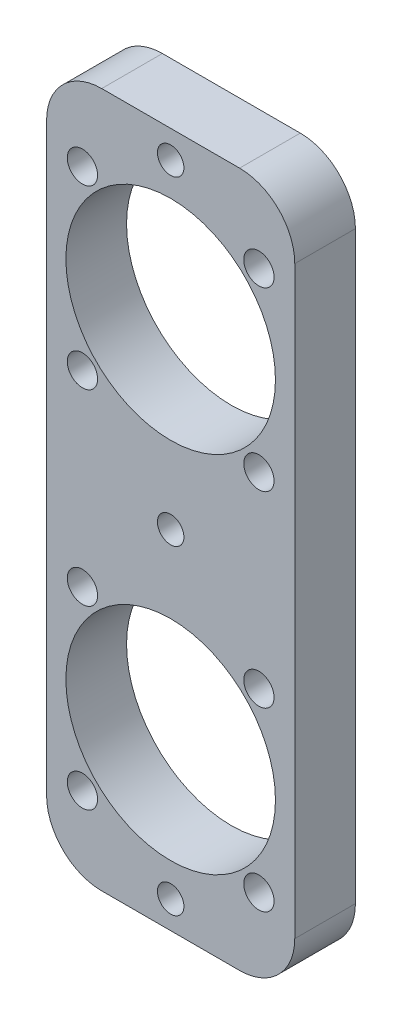
ISO-10303-21;
HEADER;
FILE_DESCRIPTION(('STEP AP214'),'2;1');
FILE_NAME('part.step','',(''),(''),'','','');
FILE_SCHEMA(('AUTOMOTIVE_DESIGN { 1 0 10303 214 1 1 1 1 }'));
ENDSEC;
DATA;
#1=APPLICATION_CONTEXT('core data for automotive mechanical design processes');
#2=APPLICATION_PROTOCOL_DEFINITION('international standard','automotive_design',2000,#1);
#3=PRODUCT_CONTEXT('',#1,'mechanical');
#4=PRODUCT('Part','Part','',(#3));
#5=PRODUCT_RELATED_PRODUCT_CATEGORY('part','',(#4));
#6=PRODUCT_DEFINITION_FORMATION('','',#4);
#7=PRODUCT_DEFINITION_CONTEXT('part definition',#1,'design');
#8=PRODUCT_DEFINITION('design','',#6,#7);
#9=PRODUCT_DEFINITION_SHAPE('','',#8);
#10=(LENGTH_UNIT() NAMED_UNIT(*) SI_UNIT(.MILLI.,.METRE.));
#11=(NAMED_UNIT(*) PLANE_ANGLE_UNIT() SI_UNIT($,.RADIAN.));
#12=(NAMED_UNIT(*) SI_UNIT($,.STERADIAN.) SOLID_ANGLE_UNIT());
#13=UNCERTAINTY_MEASURE_WITH_UNIT(LENGTH_MEASURE(1.E-05),#10,'distance_accuracy_value','');
#14=(GEOMETRIC_REPRESENTATION_CONTEXT(3) GLOBAL_UNCERTAINTY_ASSIGNED_CONTEXT((#13)) GLOBAL_UNIT_ASSIGNED_CONTEXT((#10,
#11,#12)) REPRESENTATION_CONTEXT('',''));
#15=CARTESIAN_POINT('',(0.,0.,0.));
#16=DIRECTION('',(0.,0.,1.));
#17=DIRECTION('',(1.,0.,0.));
#18=AXIS2_PLACEMENT_3D('',#15,#16,#17);
#19=CARTESIAN_POINT('',(-22.5,0.,-11.));
#20=DIRECTION('',(1.,0.,0.));
#21=DIRECTION('',(0.,0.,-1.));
#22=AXIS2_PLACEMENT_3D('',#19,#20,#21);
#23=PLANE('',#22);
#24=DIRECTION('',(0.,1.,0.));
#25=VECTOR('',#24,1.);
#26=CARTESIAN_POINT('',(-22.5,0.,-11.));
#27=LINE('',#26,#25);
#28=CARTESIAN_POINT('',(-22.5,-86.0000000000003,-11.));
#29=VERTEX_POINT('',#28);
#30=CARTESIAN_POINT('',(-22.5,20.0000000000001,-11.));
#31=VERTEX_POINT('',#30);
#32=EDGE_CURVE('E134',#29,#31,#27,.T.);
#33=ORIENTED_EDGE('',*,*,#32,.F.);
#34=DIRECTION('',(0.,0.,1.));
#35=VECTOR('',#34,1.);
#36=CARTESIAN_POINT('',(-22.5,-86.0000000000003,0.));
#37=LINE('',#36,#35);
#38=CARTESIAN_POINT('',(-22.5,-86.0000000000003,0.));
#39=VERTEX_POINT('',#38);
#40=EDGE_CURVE('E119',#29,#39,#37,.T.);
#41=ORIENTED_EDGE('',*,*,#40,.T.);
#42=DIRECTION('',(0.,1.,0.));
#43=VECTOR('',#42,1.);
#44=CARTESIAN_POINT('',(-22.5,0.,0.));
#45=LINE('',#44,#43);
#46=CARTESIAN_POINT('',(-22.5,20.0000000000001,0.));
#47=VERTEX_POINT('',#46);
#48=EDGE_CURVE('E132',#39,#47,#45,.T.);
#49=ORIENTED_EDGE('',*,*,#48,.T.);
#50=DIRECTION('',(0.,0.,1.));
#51=VECTOR('',#50,1.);
#52=CARTESIAN_POINT('',(-22.5,20.0000000000001,-11.));
#53=LINE('',#52,#51);
#54=EDGE_CURVE('E137',#47,#31,#53,.F.);
#55=ORIENTED_EDGE('',*,*,#54,.T.);
#56=EDGE_LOOP('',(#33,#41,#49,#55));
#57=FACE_BOUND('',#56,.T.);
#58=ADVANCED_FACE('F49',(#57),#23,.F.);
#59=CARTESIAN_POINT('',(0.,30.0000000000001,-11.));
#60=DIRECTION('',(0.,-1.,0.));
#61=DIRECTION('',(0.,0.,-1.));
#62=AXIS2_PLACEMENT_3D('',#59,#60,#61);
#63=PLANE('',#62);
#64=DIRECTION('',(1.,0.,0.));
#65=VECTOR('',#64,1.);
#66=CARTESIAN_POINT('',(0.,30.0000000000001,0.));
#67=LINE('',#66,#65);
#68=CARTESIAN_POINT('',(-12.5,30.0000000000001,0.));
#69=VERTEX_POINT('',#68);
#70=CARTESIAN_POINT('',(12.5,30.0000000000001,0.));
#71=VERTEX_POINT('',#70);
#72=EDGE_CURVE('E143',#69,#71,#67,.T.);
#73=ORIENTED_EDGE('',*,*,#72,.T.);
#74=DIRECTION('',(0.,0.,1.));
#75=VECTOR('',#74,1.);
#76=CARTESIAN_POINT('',(12.5,30.0000000000001,-11.));
#77=LINE('',#76,#75);
#78=CARTESIAN_POINT('',(12.5,30.0000000000001,-11.));
#79=VERTEX_POINT('',#78);
#80=EDGE_CURVE('E11',#71,#79,#77,.F.);
#81=ORIENTED_EDGE('',*,*,#80,.T.);
#82=DIRECTION('',(1.,0.,0.));
#83=VECTOR('',#82,1.);
#84=CARTESIAN_POINT('',(0.,30.0000000000001,-11.));
#85=LINE('',#84,#83);
#86=CARTESIAN_POINT('',(-12.5,30.0000000000001,-11.));
#87=VERTEX_POINT('',#86);
#88=EDGE_CURVE('E148',#87,#79,#85,.T.);
#89=ORIENTED_EDGE('',*,*,#88,.F.);
#90=DIRECTION('',(0.,0.,1.));
#91=VECTOR('',#90,1.);
#92=CARTESIAN_POINT('',(-12.5,30.0000000000001,-11.));
#93=LINE('',#92,#91);
#94=EDGE_CURVE('E58',#87,#69,#93,.T.);
#95=ORIENTED_EDGE('',*,*,#94,.T.);
#96=EDGE_LOOP('',(#73,#81,#89,#95));
#97=FACE_BOUND('',#96,.T.);
#98=ADVANCED_FACE('F188',(#97),#63,.F.);
#99=CARTESIAN_POINT('',(22.5,0.,-11.));
#100=DIRECTION('',(1.,0.,0.));
#101=DIRECTION('',(0.,0.,-1.));
#102=AXIS2_PLACEMENT_3D('',#99,#100,#101);
#103=PLANE('',#102);
#104=DIRECTION('',(0.,1.,0.));
#105=VECTOR('',#104,1.);
#106=CARTESIAN_POINT('',(22.5,0.,0.));
#107=LINE('',#106,#105);
#108=CARTESIAN_POINT('',(22.5,-86.0000000000003,0.));
#109=VERTEX_POINT('',#108);
#110=CARTESIAN_POINT('',(22.5,20.0000000000001,0.));
#111=VERTEX_POINT('',#110);
#112=EDGE_CURVE('E150',#109,#111,#107,.T.);
#113=ORIENTED_EDGE('',*,*,#112,.F.);
#114=DIRECTION('',(0.,0.,1.));
#115=VECTOR('',#114,1.);
#116=CARTESIAN_POINT('',(22.5,-86.0000000000003,-11.));
#117=LINE('',#116,#115);
#118=CARTESIAN_POINT('',(22.5,-86.0000000000003,-11.));
#119=VERTEX_POINT('',#118);
#120=EDGE_CURVE('E183',#109,#119,#117,.F.);
#121=ORIENTED_EDGE('',*,*,#120,.T.);
#122=DIRECTION('',(0.,1.,0.));
#123=VECTOR('',#122,1.);
#124=CARTESIAN_POINT('',(22.5,0.,-11.));
#125=LINE('',#124,#123);
#126=CARTESIAN_POINT('',(22.5,20.0000000000001,-11.));
#127=VERTEX_POINT('',#126);
#128=EDGE_CURVE('E142',#119,#127,#125,.T.);
#129=ORIENTED_EDGE('',*,*,#128,.T.);
#130=DIRECTION('',(0.,0.,1.));
#131=VECTOR('',#130,1.);
#132=CARTESIAN_POINT('',(22.5,20.0000000000001,0.));
#133=LINE('',#132,#131);
#134=EDGE_CURVE('E179',#127,#111,#133,.T.);
#135=ORIENTED_EDGE('',*,*,#134,.T.);
#136=EDGE_LOOP('',(#113,#121,#129,#135));
#137=FACE_BOUND('',#136,.T.);
#138=ADVANCED_FACE('F197',(#137),#103,.T.);
#139=CARTESIAN_POINT('',(0.,0.,-11.));
#140=DIRECTION('',(0.,0.,1.));
#141=DIRECTION('',(1.,0.,0.));
#142=AXIS2_PLACEMENT_3D('',#139,#140,#141);
#143=PLANE('',#142);
#144=CARTESIAN_POINT('',(0.,-91.0000000000003,-11.));
#145=DIRECTION('',(0.,0.,1.));
#146=DIRECTION('',(1.,0.,0.));
#147=AXIS2_PLACEMENT_3D('',#144,#145,#146);
#148=CIRCLE('',#147,2.4);
#149=CARTESIAN_POINT('',(2.4,-91.0000000000003,-11.));
#150=VERTEX_POINT('',#149);
#151=EDGE_CURVE('E591',#150,#150,#148,.T.);
#152=ORIENTED_EDGE('',*,*,#151,.T.);
#153=EDGE_LOOP('',(#152));
#154=FACE_BOUND('',#153,.T.);
#155=CARTESIAN_POINT('',(0.,-33.0000000000001,-11.));
#156=DIRECTION('',(0.,0.,1.));
#157=DIRECTION('',(1.,0.,0.));
#158=AXIS2_PLACEMENT_3D('',#155,#156,#157);
#159=CIRCLE('',#158,2.4);
#160=CARTESIAN_POINT('',(2.4,-33.0000000000001,-11.));
#161=VERTEX_POINT('',#160);
#162=EDGE_CURVE('E595',#161,#161,#159,.T.);
#163=ORIENTED_EDGE('',*,*,#162,.T.);
#164=EDGE_LOOP('',(#163));
#165=FACE_BOUND('',#164,.T.);
#166=CARTESIAN_POINT('',(0.,25.0000000000001,-11.));
#167=DIRECTION('',(0.,0.,1.));
#168=DIRECTION('',(1.,0.,0.));
#169=AXIS2_PLACEMENT_3D('',#166,#167,#168);
#170=CIRCLE('',#169,2.4);
#171=CARTESIAN_POINT('',(2.39999999999999,25.0000000000001,-11.));
#172=VERTEX_POINT('',#171);
#173=EDGE_CURVE('E599',#172,#172,#170,.T.);
#174=ORIENTED_EDGE('',*,*,#173,.T.);
#175=EDGE_LOOP('',(#174));
#176=FACE_BOUND('',#175,.T.);
#177=CARTESIAN_POINT('',(0.,-66.0000000000002,-11.));
#178=DIRECTION('',(0.,0.,-1.));
#179=DIRECTION('',(1.,0.,0.));
#180=AXIS2_PLACEMENT_3D('',#177,#178,#179);
#181=CIRCLE('',#180,19.);
#182=CARTESIAN_POINT('',(19.,-66.0000000000002,-11.));
#183=VERTEX_POINT('',#182);
#184=EDGE_CURVE('E603',#183,#183,#181,.T.);
#185=ORIENTED_EDGE('',*,*,#184,.F.);
#186=EDGE_LOOP('',(#185));
#187=FACE_BOUND('',#186,.T.);
#188=CARTESIAN_POINT('',(0.,0.,-11.));
#189=DIRECTION('',(0.,0.,1.));
#190=DIRECTION('',(1.,0.,0.));
#191=AXIS2_PLACEMENT_3D('',#188,#189,#190);
#192=CIRCLE('',#191,19.);
#193=CARTESIAN_POINT('',(19.,0.,-11.));
#194=VERTEX_POINT('',#193);
#195=EDGE_CURVE('E223',#194,#194,#192,.T.);
#196=ORIENTED_EDGE('',*,*,#195,.T.);
#197=EDGE_LOOP('',(#196));
#198=FACE_BOUND('',#197,.T.);
#199=DIRECTION('',(1.,0.,0.));
#200=VECTOR('',#199,1.);
#201=CARTESIAN_POINT('',(0.,-96.0000000000003,-11.));
#202=LINE('',#201,#200);
#203=CARTESIAN_POINT('',(-12.5,-96.0000000000003,-11.));
#204=VERTEX_POINT('',#203);
#205=CARTESIAN_POINT('',(12.5,-96.0000000000003,-11.));
#206=VERTEX_POINT('',#205);
#207=EDGE_CURVE('E210',#204,#206,#202,.T.);
#208=ORIENTED_EDGE('',*,*,#207,.F.);
#209=CARTESIAN_POINT('',(-12.5,-86.0000000000003,-11.));
#210=DIRECTION('',(0.,0.,1.));
#211=DIRECTION('',(1.,0.,0.));
#212=AXIS2_PLACEMENT_3D('',#209,#210,#211);
#213=CIRCLE('',#212,10.);
#214=EDGE_CURVE('E176',#204,#29,#213,.F.);
#215=ORIENTED_EDGE('',*,*,#214,.T.);
#216=ORIENTED_EDGE('',*,*,#32,.T.);
#217=CARTESIAN_POINT('',(-12.5,20.0000000000001,-11.));
#218=DIRECTION('',(0.,0.,1.));
#219=DIRECTION('',(1.,0.,0.));
#220=AXIS2_PLACEMENT_3D('',#217,#218,#219);
#221=CIRCLE('',#220,10.);
#222=EDGE_CURVE('E70',#31,#87,#221,.F.);
#223=ORIENTED_EDGE('',*,*,#222,.T.);
#224=ORIENTED_EDGE('',*,*,#88,.T.);
#225=CARTESIAN_POINT('',(12.5,20.0000000000001,-11.));
#226=DIRECTION('',(0.,0.,1.));
#227=DIRECTION('',(1.,0.,0.));
#228=AXIS2_PLACEMENT_3D('',#225,#226,#227);
#229=CIRCLE('',#228,10.);
#230=EDGE_CURVE('E170',#79,#127,#229,.F.);
#231=ORIENTED_EDGE('',*,*,#230,.T.);
#232=ORIENTED_EDGE('',*,*,#128,.F.);
#233=CARTESIAN_POINT('',(12.5,-86.0000000000003,-11.));
#234=DIRECTION('',(0.,0.,1.));
#235=DIRECTION('',(1.,0.,0.));
#236=AXIS2_PLACEMENT_3D('',#233,#234,#235);
#237=CIRCLE('',#236,10.);
#238=EDGE_CURVE('E173',#119,#206,#237,.F.);
#239=ORIENTED_EDGE('',*,*,#238,.T.);
#240=EDGE_LOOP('',(#208,#215,#216,#223,#224,#231,#232,#239));
#241=FACE_BOUND('',#240,.T.);
#242=ADVANCED_FACE('F202',(#154,#165,#176,#187,#198,#241),#143,.F.);
#243=CARTESIAN_POINT('',(0.,0.,0.));
#244=DIRECTION('',(0.,0.,1.));
#245=DIRECTION('',(1.,0.,0.));
#246=AXIS2_PLACEMENT_3D('',#243,#244,#245);
#247=PLANE('',#246);
#248=CARTESIAN_POINT('',(0.,-91.0000000000003,0.));
#249=DIRECTION('',(0.,0.,1.));
#250=DIRECTION('',(1.,0.,0.));
#251=AXIS2_PLACEMENT_3D('',#248,#249,#250);
#252=CIRCLE('',#251,2.39999999999999);
#253=CARTESIAN_POINT('',(2.39999999999999,-91.0000000000003,0.));
#254=VERTEX_POINT('',#253);
#255=EDGE_CURVE('E682',#254,#254,#252,.T.);
#256=ORIENTED_EDGE('',*,*,#255,.F.);
#257=EDGE_LOOP('',(#256));
#258=FACE_BOUND('',#257,.T.);
#259=CARTESIAN_POINT('',(0.,-33.0000000000001,0.));
#260=DIRECTION('',(0.,0.,1.));
#261=DIRECTION('',(1.,0.,0.));
#262=AXIS2_PLACEMENT_3D('',#259,#260,#261);
#263=CIRCLE('',#262,2.39999999999999);
#264=CARTESIAN_POINT('',(2.39999999999999,-33.0000000000001,0.));
#265=VERTEX_POINT('',#264);
#266=EDGE_CURVE('E676',#265,#265,#263,.T.);
#267=ORIENTED_EDGE('',*,*,#266,.F.);
#268=EDGE_LOOP('',(#267));
#269=FACE_BOUND('',#268,.T.);
#270=CARTESIAN_POINT('',(0.,25.0000000000001,0.));
#271=DIRECTION('',(0.,0.,1.));
#272=DIRECTION('',(1.,0.,0.));
#273=AXIS2_PLACEMENT_3D('',#270,#271,#272);
#274=CIRCLE('',#273,2.39999999999999);
#275=CARTESIAN_POINT('',(2.39999999999998,25.0000000000001,0.));
#276=VERTEX_POINT('',#275);
#277=EDGE_CURVE('E670',#276,#276,#274,.T.);
#278=ORIENTED_EDGE('',*,*,#277,.F.);
#279=EDGE_LOOP('',(#278));
#280=FACE_BOUND('',#279,.T.);
#281=CARTESIAN_POINT('',(0.,-66.0000000000002,0.));
#282=DIRECTION('',(0.,0.,-1.));
#283=DIRECTION('',(1.,0.,0.));
#284=AXIS2_PLACEMENT_3D('',#281,#282,#283);
#285=CIRCLE('',#284,19.);
#286=CARTESIAN_POINT('',(19.,-66.0000000000002,0.));
#287=VERTEX_POINT('',#286);
#288=EDGE_CURVE('E622',#287,#287,#285,.T.);
#289=ORIENTED_EDGE('',*,*,#288,.T.);
#290=EDGE_LOOP('',(#289));
#291=FACE_BOUND('',#290,.T.);
#292=CARTESIAN_POINT('',(-16.,-50.0000000000002,0.));
#293=DIRECTION('',(0.,0.,-1.));
#294=DIRECTION('',(1.,0.,0.));
#295=AXIS2_PLACEMENT_3D('',#292,#293,#294);
#296=CIRCLE('',#295,2.75);
#297=CARTESIAN_POINT('',(-13.25,-50.0000000000002,0.));
#298=VERTEX_POINT('',#297);
#299=EDGE_CURVE('E621',#298,#298,#296,.T.);
#300=ORIENTED_EDGE('',*,*,#299,.T.);
#301=EDGE_LOOP('',(#300));
#302=FACE_BOUND('',#301,.T.);
#303=CARTESIAN_POINT('',(16.,-50.0000000000002,0.));
#304=DIRECTION('',(0.,0.,-1.));
#305=DIRECTION('',(1.,0.,0.));
#306=AXIS2_PLACEMENT_3D('',#303,#304,#305);
#307=CIRCLE('',#306,2.75);
#308=CARTESIAN_POINT('',(18.75,-50.0000000000002,0.));
#309=VERTEX_POINT('',#308);
#310=EDGE_CURVE('E646',#309,#309,#307,.T.);
#311=ORIENTED_EDGE('',*,*,#310,.T.);
#312=EDGE_LOOP('',(#311));
#313=FACE_BOUND('',#312,.T.);
#314=CARTESIAN_POINT('',(16.,-82.0000000000002,0.));
#315=DIRECTION('',(0.,0.,-1.));
#316=DIRECTION('',(1.,0.,0.));
#317=AXIS2_PLACEMENT_3D('',#314,#315,#316);
#318=CIRCLE('',#317,2.75);
#319=CARTESIAN_POINT('',(18.75,-82.0000000000002,0.));
#320=VERTEX_POINT('',#319);
#321=EDGE_CURVE('E638',#320,#320,#318,.T.);
#322=ORIENTED_EDGE('',*,*,#321,.T.);
#323=EDGE_LOOP('',(#322));
#324=FACE_BOUND('',#323,.T.);
#325=CARTESIAN_POINT('',(-16.,-82.0000000000002,0.));
#326=DIRECTION('',(0.,0.,-1.));
#327=DIRECTION('',(1.,0.,0.));
#328=AXIS2_PLACEMENT_3D('',#325,#326,#327);
#329=CIRCLE('',#328,2.75);
#330=CARTESIAN_POINT('',(-13.25,-82.0000000000002,0.));
#331=VERTEX_POINT('',#330);
#332=EDGE_CURVE('E219',#331,#331,#329,.T.);
#333=ORIENTED_EDGE('',*,*,#332,.T.);
#334=EDGE_LOOP('',(#333));
#335=FACE_BOUND('',#334,.T.);
#336=CARTESIAN_POINT('',(0.,0.,0.));
#337=DIRECTION('',(0.,0.,1.));
#338=DIRECTION('',(1.,0.,0.));
#339=AXIS2_PLACEMENT_3D('',#336,#337,#338);
#340=CIRCLE('',#339,19.);
#341=CARTESIAN_POINT('',(19.,0.,0.));
#342=VERTEX_POINT('',#341);
#343=EDGE_CURVE('E216',#342,#342,#340,.T.);
#344=ORIENTED_EDGE('',*,*,#343,.F.);
#345=EDGE_LOOP('',(#344));
#346=FACE_BOUND('',#345,.T.);
#347=CARTESIAN_POINT('',(-16.,-16.,0.));
#348=DIRECTION('',(0.,0.,1.));
#349=DIRECTION('',(1.,0.,0.));
#350=AXIS2_PLACEMENT_3D('',#347,#348,#349);
#351=CIRCLE('',#350,2.75);
#352=CARTESIAN_POINT('',(-13.25,-16.,0.));
#353=VERTEX_POINT('',#352);
#354=EDGE_CURVE('E248',#353,#353,#351,.T.);
#355=ORIENTED_EDGE('',*,*,#354,.F.);
#356=EDGE_LOOP('',(#355));
#357=FACE_BOUND('',#356,.T.);
#358=CARTESIAN_POINT('',(16.,-16.,0.));
#359=DIRECTION('',(0.,0.,1.));
#360=DIRECTION('',(1.,0.,0.));
#361=AXIS2_PLACEMENT_3D('',#358,#359,#360);
#362=CIRCLE('',#361,2.75);
#363=CARTESIAN_POINT('',(18.75,-16.,0.));
#364=VERTEX_POINT('',#363);
#365=EDGE_CURVE('E240',#364,#364,#362,.T.);
#366=ORIENTED_EDGE('',*,*,#365,.F.);
#367=EDGE_LOOP('',(#366));
#368=FACE_BOUND('',#367,.T.);
#369=CARTESIAN_POINT('',(16.,16.,0.));
#370=DIRECTION('',(0.,0.,1.));
#371=DIRECTION('',(1.,0.,0.));
#372=AXIS2_PLACEMENT_3D('',#369,#370,#371);
#373=CIRCLE('',#372,2.75);
#374=CARTESIAN_POINT('',(18.75,16.,0.));
#375=VERTEX_POINT('',#374);
#376=EDGE_CURVE('E231',#375,#375,#373,.T.);
#377=ORIENTED_EDGE('',*,*,#376,.F.);
#378=EDGE_LOOP('',(#377));
#379=FACE_BOUND('',#378,.T.);
#380=CARTESIAN_POINT('',(-16.,16.,0.));
#381=DIRECTION('',(0.,0.,1.));
#382=DIRECTION('',(1.,0.,0.));
#383=AXIS2_PLACEMENT_3D('',#380,#381,#382);
#384=CIRCLE('',#383,2.75);
#385=CARTESIAN_POINT('',(-13.25,16.,0.));
#386=VERTEX_POINT('',#385);
#387=EDGE_CURVE('E235',#386,#386,#384,.T.);
#388=ORIENTED_EDGE('',*,*,#387,.F.);
#389=EDGE_LOOP('',(#388));
#390=FACE_BOUND('',#389,.T.);
#391=ORIENTED_EDGE('',*,*,#48,.F.);
#392=CARTESIAN_POINT('',(-12.5,-86.0000000000003,0.));
#393=DIRECTION('',(0.,0.,1.));
#394=DIRECTION('',(1.,0.,0.));
#395=AXIS2_PLACEMENT_3D('',#392,#393,#394);
#396=CIRCLE('',#395,10.);
#397=CARTESIAN_POINT('',(-12.5,-96.0000000000003,0.));
#398=VERTEX_POINT('',#397);
#399=EDGE_CURVE('E115',#39,#398,#396,.T.);
#400=ORIENTED_EDGE('',*,*,#399,.T.);
#401=DIRECTION('',(1.,0.,0.));
#402=VECTOR('',#401,1.);
#403=CARTESIAN_POINT('',(0.,-96.0000000000003,0.));
#404=LINE('',#403,#402);
#405=CARTESIAN_POINT('',(12.5,-96.0000000000003,0.));
#406=VERTEX_POINT('',#405);
#407=EDGE_CURVE('E209',#398,#406,#404,.T.);
#408=ORIENTED_EDGE('',*,*,#407,.T.);
#409=CARTESIAN_POINT('',(12.5,-86.0000000000003,0.));
#410=DIRECTION('',(0.,0.,1.));
#411=DIRECTION('',(1.,0.,0.));
#412=AXIS2_PLACEMENT_3D('',#409,#410,#411);
#413=CIRCLE('',#412,10.);
#414=EDGE_CURVE('E127',#406,#109,#413,.T.);
#415=ORIENTED_EDGE('',*,*,#414,.T.);
#416=ORIENTED_EDGE('',*,*,#112,.T.);
#417=CARTESIAN_POINT('',(12.5,20.0000000000001,0.));
#418=DIRECTION('',(0.,0.,1.));
#419=DIRECTION('',(1.,0.,0.));
#420=AXIS2_PLACEMENT_3D('',#417,#418,#419);
#421=CIRCLE('',#420,10.);
#422=EDGE_CURVE('E158',#111,#71,#421,.T.);
#423=ORIENTED_EDGE('',*,*,#422,.T.);
#424=ORIENTED_EDGE('',*,*,#72,.F.);
#425=CARTESIAN_POINT('',(-12.5,20.0000000000001,0.));
#426=DIRECTION('',(0.,0.,1.));
#427=DIRECTION('',(1.,0.,0.));
#428=AXIS2_PLACEMENT_3D('',#425,#426,#427);
#429=CIRCLE('',#428,10.);
#430=EDGE_CURVE('E136',#69,#47,#429,.T.);
#431=ORIENTED_EDGE('',*,*,#430,.T.);
#432=EDGE_LOOP('',(#391,#400,#408,#415,#416,#423,#424,#431));
#433=FACE_BOUND('',#432,.T.);
#434=ADVANCED_FACE('F139',(#258,#269,#280,#291,#302,#313,#324,#335,#346,#357,#368,#379,#390,
#433),#247,.T.);
#435=CARTESIAN_POINT('',(-16.,16.,-8.5));
#436=DIRECTION('',(0.,0.,1.));
#437=DIRECTION('',(1.,0.,0.));
#438=AXIS2_PLACEMENT_3D('',#435,#436,#437);
#439=CYLINDRICAL_SURFACE('',#438,2.75);
#440=CARTESIAN_POINT('',(-16.,16.,-8.5));
#441=DIRECTION('',(0.,0.,1.));
#442=DIRECTION('',(1.,0.,0.));
#443=AXIS2_PLACEMENT_3D('',#440,#441,#442);
#444=CIRCLE('',#443,2.75);
#445=CARTESIAN_POINT('',(-13.25,16.,-8.5));
#446=VERTEX_POINT('',#445);
#447=EDGE_CURVE('E255',#446,#446,#444,.T.);
#448=ORIENTED_EDGE('',*,*,#447,.F.);
#449=EDGE_LOOP('',(#448));
#450=FACE_BOUND('',#449,.T.);
#451=ORIENTED_EDGE('',*,*,#387,.T.);
#452=EDGE_LOOP('',(#451));
#453=FACE_BOUND('',#452,.T.);
#454=ADVANCED_FACE('F493',(#450,#453),#439,.F.);
#455=CARTESIAN_POINT('',(-16.,16.,-8.5));
#456=DIRECTION('',(0.,0.,1.));
#457=DIRECTION('',(1.,0.,0.));
#458=AXIS2_PLACEMENT_3D('',#455,#456,#457);
#459=PLANE('',#458);
#460=ORIENTED_EDGE('',*,*,#447,.T.);
#461=EDGE_LOOP('',(#460));
#462=FACE_BOUND('',#461,.T.);
#463=ADVANCED_FACE('F484',(#462),#459,.T.);
#464=CARTESIAN_POINT('',(16.,16.,-8.5));
#465=DIRECTION('',(0.,0.,1.));
#466=DIRECTION('',(1.,0.,0.));
#467=AXIS2_PLACEMENT_3D('',#464,#465,#466);
#468=CYLINDRICAL_SURFACE('',#467,2.75);
#469=CARTESIAN_POINT('',(16.,16.,-8.5));
#470=DIRECTION('',(0.,0.,1.));
#471=DIRECTION('',(1.,0.,0.));
#472=AXIS2_PLACEMENT_3D('',#469,#470,#471);
#473=CIRCLE('',#472,2.75);
#474=CARTESIAN_POINT('',(18.75,16.,-8.5));
#475=VERTEX_POINT('',#474);
#476=EDGE_CURVE('E236',#475,#475,#473,.T.);
#477=ORIENTED_EDGE('',*,*,#476,.F.);
#478=EDGE_LOOP('',(#477));
#479=FACE_BOUND('',#478,.T.);
#480=ORIENTED_EDGE('',*,*,#376,.T.);
#481=EDGE_LOOP('',(#480));
#482=FACE_BOUND('',#481,.T.);
#483=ADVANCED_FACE('F475',(#479,#482),#468,.F.);
#484=CARTESIAN_POINT('',(16.,16.,-8.5));
#485=DIRECTION('',(0.,0.,1.));
#486=DIRECTION('',(1.,0.,0.));
#487=AXIS2_PLACEMENT_3D('',#484,#485,#486);
#488=PLANE('',#487);
#489=ORIENTED_EDGE('',*,*,#476,.T.);
#490=EDGE_LOOP('',(#489));
#491=FACE_BOUND('',#490,.T.);
#492=ADVANCED_FACE('F466',(#491),#488,.T.);
#493=CARTESIAN_POINT('',(16.,-16.,-8.5));
#494=DIRECTION('',(0.,0.,1.));
#495=DIRECTION('',(1.,0.,0.));
#496=AXIS2_PLACEMENT_3D('',#493,#494,#495);
#497=CYLINDRICAL_SURFACE('',#496,2.75);
#498=CARTESIAN_POINT('',(16.,-16.,-8.5));
#499=DIRECTION('',(0.,0.,1.));
#500=DIRECTION('',(1.,0.,0.));
#501=AXIS2_PLACEMENT_3D('',#498,#499,#500);
#502=CIRCLE('',#501,2.75);
#503=CARTESIAN_POINT('',(18.75,-16.,-8.5));
#504=VERTEX_POINT('',#503);
#505=EDGE_CURVE('E244',#504,#504,#502,.T.);
#506=ORIENTED_EDGE('',*,*,#505,.F.);
#507=EDGE_LOOP('',(#506));
#508=FACE_BOUND('',#507,.T.);
#509=ORIENTED_EDGE('',*,*,#365,.T.);
#510=EDGE_LOOP('',(#509));
#511=FACE_BOUND('',#510,.T.);
#512=ADVANCED_FACE('F457',(#508,#511),#497,.F.);
#513=CARTESIAN_POINT('',(16.,-16.,-8.5));
#514=DIRECTION('',(0.,0.,1.));
#515=DIRECTION('',(1.,0.,0.));
#516=AXIS2_PLACEMENT_3D('',#513,#514,#515);
#517=PLANE('',#516);
#518=ORIENTED_EDGE('',*,*,#505,.T.);
#519=EDGE_LOOP('',(#518));
#520=FACE_BOUND('',#519,.T.);
#521=ADVANCED_FACE('F448',(#520),#517,.T.);
#522=CARTESIAN_POINT('',(-16.,-16.,-8.5));
#523=DIRECTION('',(0.,0.,1.));
#524=DIRECTION('',(1.,0.,0.));
#525=AXIS2_PLACEMENT_3D('',#522,#523,#524);
#526=CYLINDRICAL_SURFACE('',#525,2.75);
#527=CARTESIAN_POINT('',(-16.,-16.,-8.5));
#528=DIRECTION('',(0.,0.,1.));
#529=DIRECTION('',(1.,0.,0.));
#530=AXIS2_PLACEMENT_3D('',#527,#528,#529);
#531=CIRCLE('',#530,2.75);
#532=CARTESIAN_POINT('',(-13.25,-16.,-8.5));
#533=VERTEX_POINT('',#532);
#534=EDGE_CURVE('E227',#533,#533,#531,.T.);
#535=ORIENTED_EDGE('',*,*,#534,.F.);
#536=EDGE_LOOP('',(#535));
#537=FACE_BOUND('',#536,.T.);
#538=ORIENTED_EDGE('',*,*,#354,.T.);
#539=EDGE_LOOP('',(#538));
#540=FACE_BOUND('',#539,.T.);
#541=ADVANCED_FACE('F439',(#537,#540),#526,.F.);
#542=CARTESIAN_POINT('',(-16.,-16.,-8.5));
#543=DIRECTION('',(0.,0.,1.));
#544=DIRECTION('',(1.,0.,0.));
#545=AXIS2_PLACEMENT_3D('',#542,#543,#544);
#546=PLANE('',#545);
#547=ORIENTED_EDGE('',*,*,#534,.T.);
#548=EDGE_LOOP('',(#547));
#549=FACE_BOUND('',#548,.T.);
#550=ADVANCED_FACE('F429',(#549),#546,.T.);
#551=CARTESIAN_POINT('',(0.,0.,-11.));
#552=DIRECTION('',(0.,0.,1.));
#553=DIRECTION('',(1.,0.,0.));
#554=AXIS2_PLACEMENT_3D('',#551,#552,#553);
#555=CYLINDRICAL_SURFACE('',#554,19.);
#556=ORIENTED_EDGE('',*,*,#195,.F.);
#557=EDGE_LOOP('',(#556));
#558=FACE_BOUND('',#557,.T.);
#559=ORIENTED_EDGE('',*,*,#343,.T.);
#560=EDGE_LOOP('',(#559));
#561=FACE_BOUND('',#560,.T.);
#562=ADVANCED_FACE('F420',(#558,#561),#555,.F.);
#563=CARTESIAN_POINT('',(0.,-96.0000000000003,-11.));
#564=DIRECTION('',(0.,-1.,0.));
#565=DIRECTION('',(0.,0.,-1.));
#566=AXIS2_PLACEMENT_3D('',#563,#564,#565);
#567=PLANE('',#566);
#568=ORIENTED_EDGE('',*,*,#407,.F.);
#569=DIRECTION('',(0.,0.,1.));
#570=VECTOR('',#569,1.);
#571=CARTESIAN_POINT('',(-12.5,-96.0000000000003,-11.));
#572=LINE('',#571,#570);
#573=EDGE_CURVE('E120',#398,#204,#572,.F.);
#574=ORIENTED_EDGE('',*,*,#573,.T.);
#575=ORIENTED_EDGE('',*,*,#207,.T.);
#576=DIRECTION('',(0.,0.,1.));
#577=VECTOR('',#576,1.);
#578=CARTESIAN_POINT('',(12.5,-96.0000000000003,-11.));
#579=LINE('',#578,#577);
#580=EDGE_CURVE('E126',#206,#406,#579,.T.);
#581=ORIENTED_EDGE('',*,*,#580,.T.);
#582=EDGE_LOOP('',(#568,#574,#575,#581));
#583=FACE_BOUND('',#582,.T.);
#584=ADVANCED_FACE('F208',(#583),#567,.T.);
#585=CARTESIAN_POINT('',(-16.,-82.0000000000002,-8.5));
#586=DIRECTION('',(0.,0.,1.));
#587=DIRECTION('',(1.,0.,0.));
#588=AXIS2_PLACEMENT_3D('',#585,#586,#587);
#589=CYLINDRICAL_SURFACE('',#588,2.75);
#590=CARTESIAN_POINT('',(-16.,-82.0000000000002,-8.5));
#591=DIRECTION('',(0.,0.,-1.));
#592=DIRECTION('',(1.,0.,0.));
#593=AXIS2_PLACEMENT_3D('',#590,#591,#592);
#594=CIRCLE('',#593,2.75);
#595=CARTESIAN_POINT('',(-13.25,-82.0000000000002,-8.5));
#596=VERTEX_POINT('',#595);
#597=EDGE_CURVE('E212',#596,#596,#594,.T.);
#598=ORIENTED_EDGE('',*,*,#597,.T.);
#599=EDGE_LOOP('',(#598));
#600=FACE_BOUND('',#599,.T.);
#601=ORIENTED_EDGE('',*,*,#332,.F.);
#602=EDGE_LOOP('',(#601));
#603=FACE_BOUND('',#602,.T.);
#604=ADVANCED_FACE('F404',(#600,#603),#589,.F.);
#605=CARTESIAN_POINT('',(-16.,-82.0000000000002,-8.5));
#606=DIRECTION('',(0.,0.,1.));
#607=DIRECTION('',(1.,0.,0.));
#608=AXIS2_PLACEMENT_3D('',#605,#606,#607);
#609=PLANE('',#608);
#610=ORIENTED_EDGE('',*,*,#597,.F.);
#611=EDGE_LOOP('',(#610));
#612=FACE_BOUND('',#611,.T.);
#613=ADVANCED_FACE('F395',(#612),#609,.T.);
#614=CARTESIAN_POINT('',(16.,-82.0000000000002,-8.5));
#615=DIRECTION('',(0.,0.,1.));
#616=DIRECTION('',(1.,0.,0.));
#617=AXIS2_PLACEMENT_3D('',#614,#615,#616);
#618=CYLINDRICAL_SURFACE('',#617,2.75);
#619=CARTESIAN_POINT('',(16.,-82.0000000000002,-8.5));
#620=DIRECTION('',(0.,0.,-1.));
#621=DIRECTION('',(1.,0.,0.));
#622=AXIS2_PLACEMENT_3D('',#619,#620,#621);
#623=CIRCLE('',#622,2.75);
#624=CARTESIAN_POINT('',(18.75,-82.0000000000002,-8.5));
#625=VERTEX_POINT('',#624);
#626=EDGE_CURVE('E634',#625,#625,#623,.T.);
#627=ORIENTED_EDGE('',*,*,#626,.T.);
#628=EDGE_LOOP('',(#627));
#629=FACE_BOUND('',#628,.T.);
#630=ORIENTED_EDGE('',*,*,#321,.F.);
#631=EDGE_LOOP('',(#630));
#632=FACE_BOUND('',#631,.T.);
#633=ADVANCED_FACE('F386',(#629,#632),#618,.F.);
#634=CARTESIAN_POINT('',(16.,-82.0000000000002,-8.5));
#635=DIRECTION('',(0.,0.,1.));
#636=DIRECTION('',(1.,0.,0.));
#637=AXIS2_PLACEMENT_3D('',#634,#635,#636);
#638=PLANE('',#637);
#639=ORIENTED_EDGE('',*,*,#626,.F.);
#640=EDGE_LOOP('',(#639));
#641=FACE_BOUND('',#640,.T.);
#642=ADVANCED_FACE('F377',(#641),#638,.T.);
#643=CARTESIAN_POINT('',(16.,-50.0000000000002,-8.5));
#644=DIRECTION('',(0.,0.,1.));
#645=DIRECTION('',(1.,0.,0.));
#646=AXIS2_PLACEMENT_3D('',#643,#644,#645);
#647=CYLINDRICAL_SURFACE('',#646,2.75);
#648=CARTESIAN_POINT('',(16.,-50.0000000000002,-8.5));
#649=DIRECTION('',(0.,0.,-1.));
#650=DIRECTION('',(1.,0.,0.));
#651=AXIS2_PLACEMENT_3D('',#648,#649,#650);
#652=CIRCLE('',#651,2.75);
#653=CARTESIAN_POINT('',(18.75,-50.0000000000002,-8.5));
#654=VERTEX_POINT('',#653);
#655=EDGE_CURVE('E642',#654,#654,#652,.T.);
#656=ORIENTED_EDGE('',*,*,#655,.T.);
#657=EDGE_LOOP('',(#656));
#658=FACE_BOUND('',#657,.T.);
#659=ORIENTED_EDGE('',*,*,#310,.F.);
#660=EDGE_LOOP('',(#659));
#661=FACE_BOUND('',#660,.T.);
#662=ADVANCED_FACE('F368',(#658,#661),#647,.F.);
#663=CARTESIAN_POINT('',(16.,-50.0000000000002,-8.5));
#664=DIRECTION('',(0.,0.,1.));
#665=DIRECTION('',(1.,0.,0.));
#666=AXIS2_PLACEMENT_3D('',#663,#664,#665);
#667=PLANE('',#666);
#668=ORIENTED_EDGE('',*,*,#655,.F.);
#669=EDGE_LOOP('',(#668));
#670=FACE_BOUND('',#669,.T.);
#671=ADVANCED_FACE('F359',(#670),#667,.T.);
#672=CARTESIAN_POINT('',(-16.,-50.0000000000002,-8.5));
#673=DIRECTION('',(0.,0.,1.));
#674=DIRECTION('',(1.,0.,0.));
#675=AXIS2_PLACEMENT_3D('',#672,#673,#674);
#676=CYLINDRICAL_SURFACE('',#675,2.75);
#677=CARTESIAN_POINT('',(-16.,-50.0000000000002,-8.5));
#678=DIRECTION('',(0.,0.,-1.));
#679=DIRECTION('',(1.,0.,0.));
#680=AXIS2_PLACEMENT_3D('',#677,#678,#679);
#681=CIRCLE('',#680,2.75);
#682=CARTESIAN_POINT('',(-13.25,-50.0000000000002,-8.5));
#683=VERTEX_POINT('',#682);
#684=EDGE_CURVE('E627',#683,#683,#681,.T.);
#685=ORIENTED_EDGE('',*,*,#684,.T.);
#686=EDGE_LOOP('',(#685));
#687=FACE_BOUND('',#686,.T.);
#688=ORIENTED_EDGE('',*,*,#299,.F.);
#689=EDGE_LOOP('',(#688));
#690=FACE_BOUND('',#689,.T.);
#691=ADVANCED_FACE('F350',(#687,#690),#676,.F.);
#692=CARTESIAN_POINT('',(-16.,-50.0000000000002,-8.5));
#693=DIRECTION('',(0.,0.,1.));
#694=DIRECTION('',(1.,0.,0.));
#695=AXIS2_PLACEMENT_3D('',#692,#693,#694);
#696=PLANE('',#695);
#697=ORIENTED_EDGE('',*,*,#684,.F.);
#698=EDGE_LOOP('',(#697));
#699=FACE_BOUND('',#698,.T.);
#700=ADVANCED_FACE('F341',(#699),#696,.T.);
#701=CARTESIAN_POINT('',(0.,-66.0000000000002,-11.));
#702=DIRECTION('',(0.,0.,1.));
#703=DIRECTION('',(1.,0.,0.));
#704=AXIS2_PLACEMENT_3D('',#701,#702,#703);
#705=CYLINDRICAL_SURFACE('',#704,19.);
#706=ORIENTED_EDGE('',*,*,#184,.T.);
#707=EDGE_LOOP('',(#706));
#708=FACE_BOUND('',#707,.T.);
#709=ORIENTED_EDGE('',*,*,#288,.F.);
#710=EDGE_LOOP('',(#709));
#711=FACE_BOUND('',#710,.T.);
#712=ADVANCED_FACE('F331',(#708,#711),#705,.F.);
#713=CARTESIAN_POINT('',(0.,25.0000000000001,0.));
#714=DIRECTION('',(0.,0.,1.));
#715=DIRECTION('',(1.,0.,0.));
#716=AXIS2_PLACEMENT_3D('',#713,#714,#715);
#717=CYLINDRICAL_SURFACE('',#716,2.39999999999999);
#718=ORIENTED_EDGE('',*,*,#173,.F.);
#719=EDGE_LOOP('',(#718));
#720=FACE_BOUND('',#719,.T.);
#721=ORIENTED_EDGE('',*,*,#277,.T.);
#722=EDGE_LOOP('',(#721));
#723=FACE_BOUND('',#722,.T.);
#724=ADVANCED_FACE('F322',(#720,#723),#717,.F.);
#725=CARTESIAN_POINT('',(0.,-33.0000000000001,0.));
#726=DIRECTION('',(0.,0.,1.));
#727=DIRECTION('',(1.,0.,0.));
#728=AXIS2_PLACEMENT_3D('',#725,#726,#727);
#729=CYLINDRICAL_SURFACE('',#728,2.39999999999999);
#730=ORIENTED_EDGE('',*,*,#162,.F.);
#731=EDGE_LOOP('',(#730));
#732=FACE_BOUND('',#731,.T.);
#733=ORIENTED_EDGE('',*,*,#266,.T.);
#734=EDGE_LOOP('',(#733));
#735=FACE_BOUND('',#734,.T.);
#736=ADVANCED_FACE('F313',(#732,#735),#729,.F.);
#737=CARTESIAN_POINT('',(0.,-91.0000000000003,0.));
#738=DIRECTION('',(0.,0.,1.));
#739=DIRECTION('',(1.,0.,0.));
#740=AXIS2_PLACEMENT_3D('',#737,#738,#739);
#741=CYLINDRICAL_SURFACE('',#740,2.39999999999999);
#742=ORIENTED_EDGE('',*,*,#151,.F.);
#743=EDGE_LOOP('',(#742));
#744=FACE_BOUND('',#743,.T.);
#745=ORIENTED_EDGE('',*,*,#255,.T.);
#746=EDGE_LOOP('',(#745));
#747=FACE_BOUND('',#746,.T.);
#748=ADVANCED_FACE('F284',(#744,#747),#741,.F.);
#749=CARTESIAN_POINT('',(-12.5,-86.0000000000003,-11.));
#750=DIRECTION('',(0.,0.,-1.));
#751=DIRECTION('',(-1.,0.,0.));
#752=AXIS2_PLACEMENT_3D('',#749,#750,#751);
#753=CYLINDRICAL_SURFACE('',#752,10.);
#754=ORIENTED_EDGE('',*,*,#214,.F.);
#755=ORIENTED_EDGE('',*,*,#573,.F.);
#756=ORIENTED_EDGE('',*,*,#399,.F.);
#757=ORIENTED_EDGE('',*,*,#40,.F.);
#758=EDGE_LOOP('',(#754,#755,#756,#757));
#759=FACE_BOUND('',#758,.T.);
#760=ADVANCED_FACE('F118',(#759),#753,.T.);
#761=CARTESIAN_POINT('',(12.5,-86.0000000000003,-11.));
#762=DIRECTION('',(0.,0.,1.));
#763=DIRECTION('',(1.,0.,0.));
#764=AXIS2_PLACEMENT_3D('',#761,#762,#763);
#765=CYLINDRICAL_SURFACE('',#764,10.);
#766=ORIENTED_EDGE('',*,*,#238,.F.);
#767=ORIENTED_EDGE('',*,*,#120,.F.);
#768=ORIENTED_EDGE('',*,*,#414,.F.);
#769=ORIENTED_EDGE('',*,*,#580,.F.);
#770=EDGE_LOOP('',(#766,#767,#768,#769));
#771=FACE_BOUND('',#770,.T.);
#772=ADVANCED_FACE('F206',(#771),#765,.T.);
#773=CARTESIAN_POINT('',(12.5,20.0000000000001,-11.));
#774=DIRECTION('',(0.,0.,-1.));
#775=DIRECTION('',(-1.,0.,0.));
#776=AXIS2_PLACEMENT_3D('',#773,#774,#775);
#777=CYLINDRICAL_SURFACE('',#776,10.);
#778=ORIENTED_EDGE('',*,*,#230,.F.);
#779=ORIENTED_EDGE('',*,*,#80,.F.);
#780=ORIENTED_EDGE('',*,*,#422,.F.);
#781=ORIENTED_EDGE('',*,*,#134,.F.);
#782=EDGE_LOOP('',(#778,#779,#780,#781));
#783=FACE_BOUND('',#782,.T.);
#784=ADVANCED_FACE('F195',(#783),#777,.T.);
#785=CARTESIAN_POINT('',(-12.5,20.0000000000001,-11.));
#786=DIRECTION('',(0.,0.,1.));
#787=DIRECTION('',(1.,0.,0.));
#788=AXIS2_PLACEMENT_3D('',#785,#786,#787);
#789=CYLINDRICAL_SURFACE('',#788,10.);
#790=ORIENTED_EDGE('',*,*,#222,.F.);
#791=ORIENTED_EDGE('',*,*,#54,.F.);
#792=ORIENTED_EDGE('',*,*,#430,.F.);
#793=ORIENTED_EDGE('',*,*,#94,.F.);
#794=EDGE_LOOP('',(#790,#791,#792,#793));
#795=FACE_BOUND('',#794,.T.);
#796=ADVANCED_FACE('F51',(#795),#789,.T.);
#797=CLOSED_SHELL('',(#58,#98,#138,#242,#434,#454,#463,#483,#492,#512,#521,#541,#550,#562,#584,
#604,#613,#633,#642,#662,#671,#691,#700,#712,#724,#736,#748,#760,#772,#784,#796));
#798=MANIFOLD_SOLID_BREP('B2',#797);
#799=ADVANCED_BREP_SHAPE_REPRESENTATION('',(#18,#798),#14);
#800=SHAPE_DEFINITION_REPRESENTATION(#9,#799);
ENDSEC;
END-ISO-10303-21;
